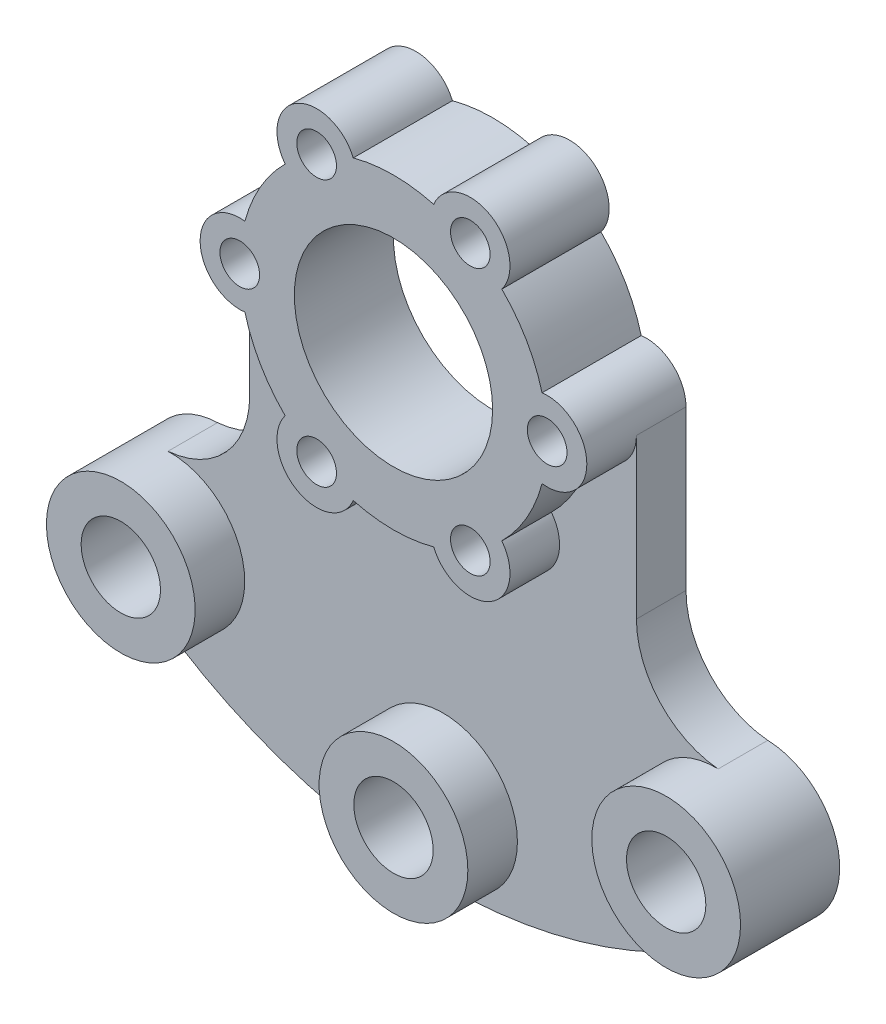
ISO-10303-21;
HEADER;
FILE_DESCRIPTION(('STEP AP214'),'2;1');
FILE_NAME('part.step','',(''),(''),'','','');
FILE_SCHEMA(('AUTOMOTIVE_DESIGN { 1 0 10303 214 1 1 1 1 }'));
ENDSEC;
DATA;
#1=APPLICATION_CONTEXT('core data for automotive mechanical design processes');
#2=APPLICATION_PROTOCOL_DEFINITION('international standard','automotive_design',2000,#1);
#3=PRODUCT_CONTEXT('',#1,'mechanical');
#4=PRODUCT('Part','Part','',(#3));
#5=PRODUCT_RELATED_PRODUCT_CATEGORY('part','',(#4));
#6=PRODUCT_DEFINITION_FORMATION('','',#4);
#7=PRODUCT_DEFINITION_CONTEXT('part definition',#1,'design');
#8=PRODUCT_DEFINITION('design','',#6,#7);
#9=PRODUCT_DEFINITION_SHAPE('','',#8);
#10=(LENGTH_UNIT() NAMED_UNIT(*) SI_UNIT(.MILLI.,.METRE.));
#11=(NAMED_UNIT(*) PLANE_ANGLE_UNIT() SI_UNIT($,.RADIAN.));
#12=(NAMED_UNIT(*) SI_UNIT($,.STERADIAN.) SOLID_ANGLE_UNIT());
#13=UNCERTAINTY_MEASURE_WITH_UNIT(LENGTH_MEASURE(1.E-05),#10,'distance_accuracy_value','');
#14=(GEOMETRIC_REPRESENTATION_CONTEXT(3) GLOBAL_UNCERTAINTY_ASSIGNED_CONTEXT((#13)) GLOBAL_UNIT_ASSIGNED_CONTEXT((#10,
#11,#12)) REPRESENTATION_CONTEXT('',''));
#15=CARTESIAN_POINT('',(0.,0.,0.));
#16=DIRECTION('',(0.,0.,1.));
#17=DIRECTION('',(1.,0.,0.));
#18=AXIS2_PLACEMENT_3D('',#15,#16,#17);
#19=CARTESIAN_POINT('',(-57.,-32.0714767894795,10.));
#20=DIRECTION('',(0.,0.,-1.));
#21=DIRECTION('',(-1.,0.,0.));
#22=AXIS2_PLACEMENT_3D('',#19,#20,#21);
#23=CYLINDRICAL_SURFACE('',#22,18.);
#24=DIRECTION('',(0.,0.,-1.));
#25=VECTOR('',#24,1.);
#26=CARTESIAN_POINT('',(-55.4895461730134,-50.0079906435299,10.));
#27=LINE('',#26,#25);
#28=CARTESIAN_POINT('',(-55.4895461730134,-50.0079906435299,10.));
#29=VERTEX_POINT('',#28);
#30=CARTESIAN_POINT('',(-55.4895461730134,-50.0079906435299,0.));
#31=VERTEX_POINT('',#30);
#32=EDGE_CURVE('E193',#29,#31,#27,.T.);
#33=ORIENTED_EDGE('',*,*,#32,.F.);
#34=CARTESIAN_POINT('',(-57.,-32.0714767894795,10.));
#35=DIRECTION('',(0.,0.,-1.));
#36=DIRECTION('',(1.,0.,0.));
#37=AXIS2_PLACEMENT_3D('',#34,#35,#36);
#38=CIRCLE('',#37,18.);
#39=CARTESIAN_POINT('',(-39.,-32.0714767894795,10.));
#40=VERTEX_POINT('',#39);
#41=EDGE_CURVE('E388',#40,#29,#38,.T.);
#42=ORIENTED_EDGE('',*,*,#41,.F.);
#43=DIRECTION('',(0.,0.,-1.));
#44=VECTOR('',#43,1.);
#45=CARTESIAN_POINT('',(-39.,-32.0714767894795,10.));
#46=LINE('',#45,#44);
#47=CARTESIAN_POINT('',(-39.,-32.0714767894795,0.));
#48=VERTEX_POINT('',#47);
#49=EDGE_CURVE('E204',#40,#48,#46,.T.);
#50=ORIENTED_EDGE('',*,*,#49,.T.);
#51=CARTESIAN_POINT('',(-57.,-32.0714767894795,0.));
#52=DIRECTION('',(0.,0.,-1.));
#53=DIRECTION('',(1.,0.,0.));
#54=AXIS2_PLACEMENT_3D('',#51,#52,#53);
#55=CIRCLE('',#54,18.);
#56=EDGE_CURVE('E186',#48,#31,#55,.T.);
#57=ORIENTED_EDGE('',*,*,#56,.T.);
#58=EDGE_LOOP('',(#33,#42,#50,#57));
#59=FACE_BOUND('',#58,.T.);
#60=ADVANCED_FACE('F43',(#59),#23,.F.);
#61=CARTESIAN_POINT('',(57.,-32.0714767894795,10.));
#62=DIRECTION('',(0.,0.,-1.));
#63=DIRECTION('',(-1.,0.,0.));
#64=AXIS2_PLACEMENT_3D('',#61,#62,#63);
#65=CYLINDRICAL_SURFACE('',#64,18.);
#66=DIRECTION('',(0.,0.,-1.));
#67=VECTOR('',#66,1.);
#68=CARTESIAN_POINT('',(55.4895461730133,-50.0079906435299,10.));
#69=LINE('',#68,#67);
#70=CARTESIAN_POINT('',(55.4895461730133,-50.0079906435299,0.));
#71=VERTEX_POINT('',#70);
#72=CARTESIAN_POINT('',(55.4895461730133,-50.0079906435299,10.));
#73=VERTEX_POINT('',#72);
#74=EDGE_CURVE('E362',#71,#73,#69,.F.);
#75=ORIENTED_EDGE('',*,*,#74,.F.);
#76=CARTESIAN_POINT('',(57.,-32.0714767894795,0.));
#77=DIRECTION('',(0.,0.,-1.));
#78=DIRECTION('',(-1.,0.,0.));
#79=AXIS2_PLACEMENT_3D('',#76,#77,#78);
#80=CIRCLE('',#79,18.);
#81=CARTESIAN_POINT('',(39.,-32.0714767894795,0.));
#82=VERTEX_POINT('',#81);
#83=EDGE_CURVE('E213',#71,#82,#80,.T.);
#84=ORIENTED_EDGE('',*,*,#83,.T.);
#85=DIRECTION('',(0.,0.,-1.));
#86=VECTOR('',#85,1.);
#87=CARTESIAN_POINT('',(39.,-32.0714767894795,10.));
#88=LINE('',#87,#86);
#89=CARTESIAN_POINT('',(39.,-32.0714767894795,10.));
#90=VERTEX_POINT('',#89);
#91=EDGE_CURVE('E222',#90,#82,#88,.T.);
#92=ORIENTED_EDGE('',*,*,#91,.F.);
#93=CARTESIAN_POINT('',(57.,-32.0714767894795,10.));
#94=DIRECTION('',(0.,0.,-1.));
#95=DIRECTION('',(-1.,0.,0.));
#96=AXIS2_PLACEMENT_3D('',#93,#94,#95);
#97=CIRCLE('',#96,18.);
#98=EDGE_CURVE('E392',#73,#90,#97,.T.);
#99=ORIENTED_EDGE('',*,*,#98,.F.);
#100=EDGE_LOOP('',(#75,#84,#92,#99));
#101=FACE_BOUND('',#100,.T.);
#102=ADVANCED_FACE('F488',(#101),#65,.F.);
#103=CARTESIAN_POINT('',(-31.,2.16471843008274E-13,20.));
#104=DIRECTION('',(0.,0.,-1.));
#105=DIRECTION('',(-1.,0.,0.));
#106=AXIS2_PLACEMENT_3D('',#103,#104,#105);
#107=CYLINDRICAL_SURFACE('',#106,7.99999999999999);
#108=DIRECTION('',(0.,0.,-1.));
#109=VECTOR('',#108,1.);
#110=CARTESIAN_POINT('',(-39.,0.,10.));
#111=LINE('',#110,#109);
#112=CARTESIAN_POINT('',(-39.,0.,10.));
#113=VERTEX_POINT('',#112);
#114=CARTESIAN_POINT('',(-39.,2.16471843008274E-13,0.));
#115=VERTEX_POINT('',#114);
#116=EDGE_CURVE('E231',#113,#115,#111,.T.);
#117=ORIENTED_EDGE('',*,*,#116,.F.);
#118=CARTESIAN_POINT('',(-30.9999999978276,2.47358876671053E-09,10.));
#119=DIRECTION('',(0.,0.,-1.));
#120=DIRECTION('',(1.,0.,0.));
#121=AXIS2_PLACEMENT_3D('',#118,#119,#120);
#122=CIRCLE('',#121,8.00000000217236);
#123=CARTESIAN_POINT('',(-29.9677419354839,-7.9331231736459,10.));
#124=VERTEX_POINT('',#123);
#125=EDGE_CURVE('E383',#124,#113,#122,.T.);
#126=ORIENTED_EDGE('',*,*,#125,.F.);
#127=DIRECTION('',(0.,0.,-1.));
#128=VECTOR('',#127,1.);
#129=CARTESIAN_POINT('',(-29.9677419354839,-7.9331231736459,20.));
#130=LINE('',#129,#128);
#131=CARTESIAN_POINT('',(-29.9677419354839,-7.9331231736459,20.));
#132=VERTEX_POINT('',#131);
#133=EDGE_CURVE('E340',#132,#124,#130,.T.);
#134=ORIENTED_EDGE('',*,*,#133,.F.);
#135=CARTESIAN_POINT('',(-31.,2.16471843008274E-13,20.));
#136=DIRECTION('',(0.,0.,1.));
#137=DIRECTION('',(1.,0.,0.));
#138=AXIS2_PLACEMENT_3D('',#135,#136,#137);
#139=CIRCLE('',#138,7.99999999999999);
#140=CARTESIAN_POINT('',(-29.9677419354838,7.93312317364634,20.));
#141=VERTEX_POINT('',#140);
#142=EDGE_CURVE('E285',#141,#132,#139,.T.);
#143=ORIENTED_EDGE('',*,*,#142,.F.);
#144=DIRECTION('',(0.,0.,-1.));
#145=VECTOR('',#144,1.);
#146=CARTESIAN_POINT('',(-29.9677419354838,7.93312317364634,20.));
#147=LINE('',#146,#145);
#148=CARTESIAN_POINT('',(-29.9677419354838,7.93312317364634,0.));
#149=VERTEX_POINT('',#148);
#150=EDGE_CURVE('E343',#141,#149,#147,.T.);
#151=ORIENTED_EDGE('',*,*,#150,.T.);
#152=CARTESIAN_POINT('',(-31.,2.16471843008274E-13,0.));
#153=DIRECTION('',(0.,0.,1.));
#154=DIRECTION('',(1.,0.,0.));
#155=AXIS2_PLACEMENT_3D('',#152,#153,#154);
#156=CIRCLE('',#155,7.99999999999999);
#157=EDGE_CURVE('E310',#149,#115,#156,.T.);
#158=ORIENTED_EDGE('',*,*,#157,.T.);
#159=EDGE_LOOP('',(#117,#126,#134,#143,#151,#158));
#160=FACE_BOUND('',#159,.T.);
#161=ADVANCED_FACE('F429',(#160),#107,.T.);
#162=CARTESIAN_POINT('',(-7.74999999999987,13.4233937586589,20.));
#163=DIRECTION('',(0.,0.,1.));
#164=DIRECTION('',(1.,0.,0.));
#165=AXIS2_PLACEMENT_3D('',#162,#163,#164);
#166=PLANE('',#165);
#167=CARTESIAN_POINT('',(-15.4999999999997,26.8467875173177,20.));
#168=DIRECTION('',(0.,0.,1.));
#169=DIRECTION('',(1.,0.,0.));
#170=AXIS2_PLACEMENT_3D('',#167,#168,#169);
#171=CIRCLE('',#170,4.);
#172=CARTESIAN_POINT('',(-11.4999999999997,26.8467875173177,20.));
#173=VERTEX_POINT('',#172);
#174=EDGE_CURVE('E241',#173,#173,#171,.T.);
#175=ORIENTED_EDGE('',*,*,#174,.F.);
#176=EDGE_LOOP('',(#175));
#177=FACE_BOUND('',#176,.T.);
#178=CARTESIAN_POINT('',(-15.5000000000001,-26.8467875173175,20.));
#179=DIRECTION('',(0.,0.,1.));
#180=DIRECTION('',(1.,0.,0.));
#181=AXIS2_PLACEMENT_3D('',#178,#179,#180);
#182=CIRCLE('',#181,4.00000000000001);
#183=CARTESIAN_POINT('',(-11.5000000000001,-26.8467875173175,20.));
#184=VERTEX_POINT('',#183);
#185=EDGE_CURVE('E253',#184,#184,#182,.T.);
#186=ORIENTED_EDGE('',*,*,#185,.F.);
#187=EDGE_LOOP('',(#186));
#188=FACE_BOUND('',#187,.T.);
#189=CARTESIAN_POINT('',(31.,0.,20.));
#190=DIRECTION('',(0.,0.,1.));
#191=DIRECTION('',(1.,0.,0.));
#192=AXIS2_PLACEMENT_3D('',#189,#190,#191);
#193=CIRCLE('',#192,4.00000000000001);
#194=CARTESIAN_POINT('',(35.,0.,20.));
#195=VERTEX_POINT('',#194);
#196=EDGE_CURVE('E265',#195,#195,#193,.T.);
#197=ORIENTED_EDGE('',*,*,#196,.F.);
#198=EDGE_LOOP('',(#197));
#199=FACE_BOUND('',#198,.T.);
#200=CARTESIAN_POINT('',(0.,0.,20.));
#201=DIRECTION('',(0.,0.,1.));
#202=DIRECTION('',(1.,0.,0.));
#203=AXIS2_PLACEMENT_3D('',#200,#201,#202);
#204=CIRCLE('',#203,31.);
#205=CARTESIAN_POINT('',(8.11358476801371,29.9193873970083,20.));
#206=VERTEX_POINT('',#205);
#207=CARTESIAN_POINT('',(-8.11358476801307,29.9193873970084,20.));
#208=VERTEX_POINT('',#207);
#209=EDGE_CURVE('E277',#206,#208,#204,.T.);
#210=ORIENTED_EDGE('',*,*,#209,.T.);
#211=CARTESIAN_POINT('',(-15.4999999999997,26.8467875173177,20.));
#212=DIRECTION('',(0.,0.,1.));
#213=DIRECTION('',(1.,0.,0.));
#214=AXIS2_PLACEMENT_3D('',#211,#212,#213);
#215=CIRCLE('',#214,8.);
#216=CARTESIAN_POINT('',(-21.8541571674703,21.9862642233624,20.));
#217=VERTEX_POINT('',#216);
#218=EDGE_CURVE('E280',#208,#217,#215,.T.);
#219=ORIENTED_EDGE('',*,*,#218,.T.);
#220=CARTESIAN_POINT('',(0.,0.,20.));
#221=DIRECTION('',(0.,0.,1.));
#222=DIRECTION('',(1.,0.,0.));
#223=AXIS2_PLACEMENT_3D('',#220,#221,#222);
#224=CIRCLE('',#223,31.);
#225=EDGE_CURVE('E283',#217,#141,#224,.T.);
#226=ORIENTED_EDGE('',*,*,#225,.T.);
#227=ORIENTED_EDGE('',*,*,#142,.T.);
#228=CARTESIAN_POINT('',(0.,0.,20.));
#229=DIRECTION('',(0.,0.,1.));
#230=DIRECTION('',(1.,0.,0.));
#231=AXIS2_PLACEMENT_3D('',#228,#229,#230);
#232=CIRCLE('',#231,31.);
#233=CARTESIAN_POINT('',(-21.8541571674706,-21.9862642233621,20.));
#234=VERTEX_POINT('',#233);
#235=EDGE_CURVE('E287',#132,#234,#232,.T.);
#236=ORIENTED_EDGE('',*,*,#235,.T.);
#237=CARTESIAN_POINT('',(-15.5000000000001,-26.8467875173175,20.));
#238=DIRECTION('',(0.,0.,1.));
#239=DIRECTION('',(1.,0.,0.));
#240=AXIS2_PLACEMENT_3D('',#237,#238,#239);
#241=CIRCLE('',#240,8.);
#242=CARTESIAN_POINT('',(-8.11358476801348,-29.9193873970083,20.));
#243=VERTEX_POINT('',#242);
#244=EDGE_CURVE('E289',#234,#243,#241,.T.);
#245=ORIENTED_EDGE('',*,*,#244,.T.);
#246=CARTESIAN_POINT('',(0.,0.,20.));
#247=DIRECTION('',(0.,0.,1.));
#248=DIRECTION('',(1.,0.,0.));
#249=AXIS2_PLACEMENT_3D('',#246,#247,#248);
#250=CIRCLE('',#249,31.);
#251=CARTESIAN_POINT('',(8.11358476801328,-29.9193873970084,20.));
#252=VERTEX_POINT('',#251);
#253=EDGE_CURVE('E291',#243,#252,#250,.T.);
#254=ORIENTED_EDGE('',*,*,#253,.T.);
#255=CARTESIAN_POINT('',(15.4999999999999,-26.8467875173176,20.));
#256=DIRECTION('',(0.,0.,1.));
#257=DIRECTION('',(1.,0.,0.));
#258=AXIS2_PLACEMENT_3D('',#255,#256,#257);
#259=CIRCLE('',#258,8.);
#260=CARTESIAN_POINT('',(21.8541571674705,-21.9862642233623,20.));
#261=VERTEX_POINT('',#260);
#262=EDGE_CURVE('E293',#252,#261,#259,.T.);
#263=ORIENTED_EDGE('',*,*,#262,.T.);
#264=CARTESIAN_POINT('',(0.,0.,20.));
#265=DIRECTION('',(0.,0.,1.));
#266=DIRECTION('',(1.,0.,0.));
#267=AXIS2_PLACEMENT_3D('',#264,#265,#266);
#268=CIRCLE('',#267,31.);
#269=CARTESIAN_POINT('',(29.9677419354839,-7.93312317364614,20.));
#270=VERTEX_POINT('',#269);
#271=EDGE_CURVE('E295',#261,#270,#268,.T.);
#272=ORIENTED_EDGE('',*,*,#271,.T.);
#273=CARTESIAN_POINT('',(31.,0.,20.));
#274=DIRECTION('',(0.,0.,1.));
#275=DIRECTION('',(1.,0.,0.));
#276=AXIS2_PLACEMENT_3D('',#273,#274,#275);
#277=CIRCLE('',#276,8.);
#278=CARTESIAN_POINT('',(29.9677419354839,7.93312317364614,20.));
#279=VERTEX_POINT('',#278);
#280=EDGE_CURVE('E297',#270,#279,#277,.T.);
#281=ORIENTED_EDGE('',*,*,#280,.T.);
#282=CARTESIAN_POINT('',(0.,0.,20.));
#283=DIRECTION('',(0.,0.,1.));
#284=DIRECTION('',(1.,0.,0.));
#285=AXIS2_PLACEMENT_3D('',#282,#283,#284);
#286=CIRCLE('',#285,31.);
#287=CARTESIAN_POINT('',(21.8541571674708,21.986264223362,20.));
#288=VERTEX_POINT('',#287);
#289=EDGE_CURVE('E299',#279,#288,#286,.T.);
#290=ORIENTED_EDGE('',*,*,#289,.T.);
#291=CARTESIAN_POINT('',(15.5000000000003,26.8467875173174,20.));
#292=DIRECTION('',(0.,0.,1.));
#293=DIRECTION('',(1.,0.,0.));
#294=AXIS2_PLACEMENT_3D('',#291,#292,#293);
#295=CIRCLE('',#294,7.99999999999999);
#296=EDGE_CURVE('E301',#288,#206,#295,.T.);
#297=ORIENTED_EDGE('',*,*,#296,.T.);
#298=EDGE_LOOP('',(#210,#219,#226,#227,#236,#245,#254,#263,#272,#281,#290,#297));
#299=FACE_BOUND('',#298,.T.);
#300=CARTESIAN_POINT('',(0.,0.,20.));
#301=DIRECTION('',(0.,0.,1.));
#302=DIRECTION('',(1.,0.,0.));
#303=AXIS2_PLACEMENT_3D('',#300,#301,#302);
#304=CIRCLE('',#303,20.);
#305=CARTESIAN_POINT('',(20.,0.,20.));
#306=VERTEX_POINT('',#305);
#307=EDGE_CURVE('E271',#306,#306,#304,.T.);
#308=ORIENTED_EDGE('',*,*,#307,.F.);
#309=EDGE_LOOP('',(#308));
#310=FACE_BOUND('',#309,.T.);
#311=CARTESIAN_POINT('',(15.4999999999999,-26.8467875173176,20.));
#312=DIRECTION('',(0.,0.,1.));
#313=DIRECTION('',(1.,0.,0.));
#314=AXIS2_PLACEMENT_3D('',#311,#312,#313);
#315=CIRCLE('',#314,4.00000000000001);
#316=CARTESIAN_POINT('',(19.4999999999999,-26.8467875173176,20.));
#317=VERTEX_POINT('',#316);
#318=EDGE_CURVE('E259',#317,#317,#315,.T.);
#319=ORIENTED_EDGE('',*,*,#318,.F.);
#320=EDGE_LOOP('',(#319));
#321=FACE_BOUND('',#320,.T.);
#322=CARTESIAN_POINT('',(-31.,2.16471843008274E-13,20.));
#323=DIRECTION('',(0.,0.,1.));
#324=DIRECTION('',(1.,0.,0.));
#325=AXIS2_PLACEMENT_3D('',#322,#323,#324);
#326=CIRCLE('',#325,4.00000000000001);
#327=CARTESIAN_POINT('',(-27.,2.16471843008274E-13,20.));
#328=VERTEX_POINT('',#327);
#329=EDGE_CURVE('E247',#328,#328,#326,.T.);
#330=ORIENTED_EDGE('',*,*,#329,.F.);
#331=EDGE_LOOP('',(#330));
#332=FACE_BOUND('',#331,.T.);
#333=CARTESIAN_POINT('',(15.5000000000003,26.8467875173174,20.));
#334=DIRECTION('',(0.,0.,1.));
#335=DIRECTION('',(1.,0.,0.));
#336=AXIS2_PLACEMENT_3D('',#333,#334,#335);
#337=CIRCLE('',#336,4.);
#338=CARTESIAN_POINT('',(19.5000000000003,26.8467875173174,20.));
#339=VERTEX_POINT('',#338);
#340=EDGE_CURVE('E235',#339,#339,#337,.T.);
#341=ORIENTED_EDGE('',*,*,#340,.F.);
#342=EDGE_LOOP('',(#341));
#343=FACE_BOUND('',#342,.T.);
#344=ADVANCED_FACE('F456',(#177,#188,#199,#299,#310,#321,#332,#343),#166,.T.);
#345=CARTESIAN_POINT('',(-7.74999999999987,13.4233937586589,0.));
#346=DIRECTION('',(0.,0.,1.));
#347=DIRECTION('',(1.,0.,0.));
#348=AXIS2_PLACEMENT_3D('',#345,#346,#347);
#349=PLANE('',#348);
#350=CARTESIAN_POINT('',(-55.,-65.,0.));
#351=DIRECTION('',(0.,0.,1.));
#352=DIRECTION('',(1.,0.,0.));
#353=AXIS2_PLACEMENT_3D('',#350,#351,#352);
#354=CIRCLE('',#353,8.00000000000001);
#355=CARTESIAN_POINT('',(-47.,-65.,0.));
#356=VERTEX_POINT('',#355);
#357=EDGE_CURVE('E844',#356,#356,#354,.T.);
#358=ORIENTED_EDGE('',*,*,#357,.T.);
#359=EDGE_LOOP('',(#358));
#360=FACE_BOUND('',#359,.T.);
#361=CARTESIAN_POINT('',(0.,-82.97,0.));
#362=DIRECTION('',(0.,0.,1.));
#363=DIRECTION('',(1.,0.,0.));
#364=AXIS2_PLACEMENT_3D('',#361,#362,#363);
#365=CIRCLE('',#364,8.00000000000002);
#366=CARTESIAN_POINT('',(8.00000000000004,-82.97,0.));
#367=VERTEX_POINT('',#366);
#368=EDGE_CURVE('E848',#367,#367,#365,.T.);
#369=ORIENTED_EDGE('',*,*,#368,.T.);
#370=EDGE_LOOP('',(#369));
#371=FACE_BOUND('',#370,.T.);
#372=CARTESIAN_POINT('',(55.,-65.,0.));
#373=DIRECTION('',(0.,0.,1.));
#374=DIRECTION('',(1.,0.,0.));
#375=AXIS2_PLACEMENT_3D('',#372,#373,#374);
#376=CIRCLE('',#375,8.00000000000002);
#377=CARTESIAN_POINT('',(63.,-65.,0.));
#378=VERTEX_POINT('',#377);
#379=EDGE_CURVE('E845',#378,#378,#376,.T.);
#380=ORIENTED_EDGE('',*,*,#379,.T.);
#381=EDGE_LOOP('',(#380));
#382=FACE_BOUND('',#381,.T.);
#383=CARTESIAN_POINT('',(0.,2.02858892996811,0.));
#384=DIRECTION('',(0.,0.,1.));
#385=DIRECTION('',(-1.,0.,0.));
#386=AXIS2_PLACEMENT_3D('',#383,#384,#385);
#387=CIRCLE('',#386,100.);
#388=CARTESIAN_POINT('',(-57.4935431919826,-79.7912894079494,0.));
#389=VERTEX_POINT('',#388);
#390=CARTESIAN_POINT('',(57.4935431919826,-79.7912894079494,0.));
#391=VERTEX_POINT('',#390);
#392=EDGE_CURVE('E187',#389,#391,#387,.T.);
#393=ORIENTED_EDGE('',*,*,#392,.F.);
#394=CARTESIAN_POINT('',(-55.,-65.,0.));
#395=DIRECTION('',(0.,0.,1.));
#396=DIRECTION('',(1.,0.,0.));
#397=AXIS2_PLACEMENT_3D('',#394,#395,#396);
#398=CIRCLE('',#397,15.);
#399=EDGE_CURVE('E180',#31,#389,#398,.T.);
#400=ORIENTED_EDGE('',*,*,#399,.F.);
#401=ORIENTED_EDGE('',*,*,#56,.F.);
#402=DIRECTION('',(0.,-1.,0.));
#403=VECTOR('',#402,1.);
#404=CARTESIAN_POINT('',(-39.,0.,0.));
#405=LINE('',#404,#403);
#406=EDGE_CURVE('E205',#115,#48,#405,.T.);
#407=ORIENTED_EDGE('',*,*,#406,.F.);
#408=ORIENTED_EDGE('',*,*,#157,.F.);
#409=CARTESIAN_POINT('',(0.,0.,0.));
#410=DIRECTION('',(0.,0.,1.));
#411=DIRECTION('',(1.,0.,0.));
#412=AXIS2_PLACEMENT_3D('',#409,#410,#411);
#413=CIRCLE('',#412,31.);
#414=CARTESIAN_POINT('',(-21.8541571674703,21.9862642233624,0.));
#415=VERTEX_POINT('',#414);
#416=EDGE_CURVE('E308',#415,#149,#413,.T.);
#417=ORIENTED_EDGE('',*,*,#416,.F.);
#418=CARTESIAN_POINT('',(-15.4999999999997,26.8467875173177,0.));
#419=DIRECTION('',(0.,0.,1.));
#420=DIRECTION('',(1.,0.,0.));
#421=AXIS2_PLACEMENT_3D('',#418,#419,#420);
#422=CIRCLE('',#421,8.);
#423=CARTESIAN_POINT('',(-8.11358476801307,29.9193873970084,0.));
#424=VERTEX_POINT('',#423);
#425=EDGE_CURVE('E306',#424,#415,#422,.T.);
#426=ORIENTED_EDGE('',*,*,#425,.F.);
#427=CARTESIAN_POINT('',(0.,0.,0.));
#428=DIRECTION('',(0.,0.,1.));
#429=DIRECTION('',(1.,0.,0.));
#430=AXIS2_PLACEMENT_3D('',#427,#428,#429);
#431=CIRCLE('',#430,31.);
#432=CARTESIAN_POINT('',(8.11358476801371,29.9193873970083,0.));
#433=VERTEX_POINT('',#432);
#434=EDGE_CURVE('E274',#433,#424,#431,.T.);
#435=ORIENTED_EDGE('',*,*,#434,.F.);
#436=CARTESIAN_POINT('',(15.5000000000003,26.8467875173174,0.));
#437=DIRECTION('',(0.,0.,1.));
#438=DIRECTION('',(1.,0.,0.));
#439=AXIS2_PLACEMENT_3D('',#436,#437,#438);
#440=CIRCLE('',#439,7.99999999999999);
#441=CARTESIAN_POINT('',(21.8541571674708,21.986264223362,0.));
#442=VERTEX_POINT('',#441);
#443=EDGE_CURVE('E281',#442,#433,#440,.T.);
#444=ORIENTED_EDGE('',*,*,#443,.F.);
#445=CARTESIAN_POINT('',(0.,0.,0.));
#446=DIRECTION('',(0.,0.,1.));
#447=DIRECTION('',(1.,0.,0.));
#448=AXIS2_PLACEMENT_3D('',#445,#446,#447);
#449=CIRCLE('',#448,31.);
#450=CARTESIAN_POINT('',(29.9677419354839,7.93312317364614,0.));
#451=VERTEX_POINT('',#450);
#452=EDGE_CURVE('E314',#451,#442,#449,.T.);
#453=ORIENTED_EDGE('',*,*,#452,.F.);
#454=CARTESIAN_POINT('',(31.,0.,0.));
#455=DIRECTION('',(0.,0.,1.));
#456=DIRECTION('',(1.,0.,0.));
#457=AXIS2_PLACEMENT_3D('',#454,#455,#456);
#458=CIRCLE('',#457,8.);
#459=CARTESIAN_POINT('',(39.,0.,0.));
#460=VERTEX_POINT('',#459);
#461=EDGE_CURVE('E312',#460,#451,#458,.T.);
#462=ORIENTED_EDGE('',*,*,#461,.F.);
#463=DIRECTION('',(0.,1.,0.));
#464=VECTOR('',#463,1.);
#465=CARTESIAN_POINT('',(39.,0.,0.));
#466=LINE('',#465,#464);
#467=EDGE_CURVE('E215',#82,#460,#466,.T.);
#468=ORIENTED_EDGE('',*,*,#467,.F.);
#469=ORIENTED_EDGE('',*,*,#83,.F.);
#470=CARTESIAN_POINT('',(55.,-65.,0.));
#471=DIRECTION('',(0.,0.,1.));
#472=DIRECTION('',(-1.,0.,0.));
#473=AXIS2_PLACEMENT_3D('',#470,#471,#472);
#474=CIRCLE('',#473,15.);
#475=EDGE_CURVE('E58',#391,#71,#474,.T.);
#476=ORIENTED_EDGE('',*,*,#475,.F.);
#477=EDGE_LOOP('',(#393,#400,#401,#407,#408,#417,#426,#435,#444,#453,#462,#468,#469,#476));
#478=FACE_BOUND('',#477,.T.);
#479=CARTESIAN_POINT('',(0.,0.,0.));
#480=DIRECTION('',(0.,0.,1.));
#481=DIRECTION('',(1.,0.,0.));
#482=AXIS2_PLACEMENT_3D('',#479,#480,#481);
#483=CIRCLE('',#482,20.);
#484=CARTESIAN_POINT('',(20.,0.,0.));
#485=VERTEX_POINT('',#484);
#486=EDGE_CURVE('E268',#485,#485,#483,.T.);
#487=ORIENTED_EDGE('',*,*,#486,.T.);
#488=EDGE_LOOP('',(#487));
#489=FACE_BOUND('',#488,.T.);
#490=CARTESIAN_POINT('',(31.,0.,0.));
#491=DIRECTION('',(0.,0.,1.));
#492=DIRECTION('',(1.,0.,0.));
#493=AXIS2_PLACEMENT_3D('',#490,#491,#492);
#494=CIRCLE('',#493,4.00000000000001);
#495=CARTESIAN_POINT('',(35.,0.,0.));
#496=VERTEX_POINT('',#495);
#497=EDGE_CURVE('E262',#496,#496,#494,.T.);
#498=ORIENTED_EDGE('',*,*,#497,.T.);
#499=EDGE_LOOP('',(#498));
#500=FACE_BOUND('',#499,.T.);
#501=CARTESIAN_POINT('',(15.4999999999999,-26.8467875173176,0.));
#502=DIRECTION('',(0.,0.,1.));
#503=DIRECTION('',(1.,0.,0.));
#504=AXIS2_PLACEMENT_3D('',#501,#502,#503);
#505=CIRCLE('',#504,4.00000000000001);
#506=CARTESIAN_POINT('',(19.4999999999999,-26.8467875173176,0.));
#507=VERTEX_POINT('',#506);
#508=EDGE_CURVE('E256',#507,#507,#505,.T.);
#509=ORIENTED_EDGE('',*,*,#508,.T.);
#510=EDGE_LOOP('',(#509));
#511=FACE_BOUND('',#510,.T.);
#512=CARTESIAN_POINT('',(-15.5000000000001,-26.8467875173175,0.));
#513=DIRECTION('',(0.,0.,1.));
#514=DIRECTION('',(1.,0.,0.));
#515=AXIS2_PLACEMENT_3D('',#512,#513,#514);
#516=CIRCLE('',#515,4.00000000000001);
#517=CARTESIAN_POINT('',(-11.5000000000001,-26.8467875173175,0.));
#518=VERTEX_POINT('',#517);
#519=EDGE_CURVE('E250',#518,#518,#516,.T.);
#520=ORIENTED_EDGE('',*,*,#519,.T.);
#521=EDGE_LOOP('',(#520));
#522=FACE_BOUND('',#521,.T.);
#523=CARTESIAN_POINT('',(-31.,2.16471843008274E-13,0.));
#524=DIRECTION('',(0.,0.,1.));
#525=DIRECTION('',(1.,0.,0.));
#526=AXIS2_PLACEMENT_3D('',#523,#524,#525);
#527=CIRCLE('',#526,4.00000000000001);
#528=CARTESIAN_POINT('',(-27.,2.16471843008274E-13,0.));
#529=VERTEX_POINT('',#528);
#530=EDGE_CURVE('E244',#529,#529,#527,.T.);
#531=ORIENTED_EDGE('',*,*,#530,.T.);
#532=EDGE_LOOP('',(#531));
#533=FACE_BOUND('',#532,.T.);
#534=CARTESIAN_POINT('',(-15.4999999999997,26.8467875173177,0.));
#535=DIRECTION('',(0.,0.,1.));
#536=DIRECTION('',(1.,0.,0.));
#537=AXIS2_PLACEMENT_3D('',#534,#535,#536);
#538=CIRCLE('',#537,4.);
#539=CARTESIAN_POINT('',(-11.4999999999997,26.8467875173177,0.));
#540=VERTEX_POINT('',#539);
#541=EDGE_CURVE('E238',#540,#540,#538,.T.);
#542=ORIENTED_EDGE('',*,*,#541,.T.);
#543=EDGE_LOOP('',(#542));
#544=FACE_BOUND('',#543,.T.);
#545=CARTESIAN_POINT('',(15.5000000000003,26.8467875173174,0.));
#546=DIRECTION('',(0.,0.,1.));
#547=DIRECTION('',(1.,0.,0.));
#548=AXIS2_PLACEMENT_3D('',#545,#546,#547);
#549=CIRCLE('',#548,4.);
#550=CARTESIAN_POINT('',(19.5000000000003,26.8467875173174,0.));
#551=VERTEX_POINT('',#550);
#552=EDGE_CURVE('E234',#551,#551,#549,.T.);
#553=ORIENTED_EDGE('',*,*,#552,.T.);
#554=EDGE_LOOP('',(#553));
#555=FACE_BOUND('',#554,.T.);
#556=ADVANCED_FACE('F182',(#360,#371,#382,#478,#489,#500,#511,#522,#533,#544,#555),#349,.F.);
#557=CARTESIAN_POINT('',(0.,0.,20.));
#558=DIRECTION('',(0.,0.,-1.));
#559=DIRECTION('',(-1.,0.,0.));
#560=AXIS2_PLACEMENT_3D('',#557,#558,#559);
#561=CYLINDRICAL_SURFACE('',#560,31.);
#562=ORIENTED_EDGE('',*,*,#434,.T.);
#563=DIRECTION('',(0.,0.,-1.));
#564=VECTOR('',#563,1.);
#565=CARTESIAN_POINT('',(-8.11358476801307,29.9193873970084,20.));
#566=LINE('',#565,#564);
#567=EDGE_CURVE('E349',#208,#424,#566,.T.);
#568=ORIENTED_EDGE('',*,*,#567,.F.);
#569=ORIENTED_EDGE('',*,*,#209,.F.);
#570=DIRECTION('',(0.,0.,-1.));
#571=VECTOR('',#570,1.);
#572=CARTESIAN_POINT('',(8.11358476801371,29.9193873970083,20.));
#573=LINE('',#572,#571);
#574=EDGE_CURVE('E303',#206,#433,#573,.T.);
#575=ORIENTED_EDGE('',*,*,#574,.T.);
#576=EDGE_LOOP('',(#562,#568,#569,#575));
#577=FACE_BOUND('',#576,.T.);
#578=ADVANCED_FACE('F45',(#577),#561,.T.);
#579=CARTESIAN_POINT('',(-15.4999999999997,26.8467875173177,20.));
#580=DIRECTION('',(0.,0.,-1.));
#581=DIRECTION('',(-1.,0.,0.));
#582=AXIS2_PLACEMENT_3D('',#579,#580,#581);
#583=CYLINDRICAL_SURFACE('',#582,8.);
#584=ORIENTED_EDGE('',*,*,#425,.T.);
#585=DIRECTION('',(0.,0.,-1.));
#586=VECTOR('',#585,1.);
#587=CARTESIAN_POINT('',(-21.8541571674703,21.9862642233624,20.));
#588=LINE('',#587,#586);
#589=EDGE_CURVE('E346',#217,#415,#588,.T.);
#590=ORIENTED_EDGE('',*,*,#589,.F.);
#591=ORIENTED_EDGE('',*,*,#218,.F.);
#592=ORIENTED_EDGE('',*,*,#567,.T.);
#593=EDGE_LOOP('',(#584,#590,#591,#592));
#594=FACE_BOUND('',#593,.T.);
#595=ADVANCED_FACE('F441',(#594),#583,.T.);
#596=CARTESIAN_POINT('',(0.,0.,20.));
#597=DIRECTION('',(0.,0.,-1.));
#598=DIRECTION('',(-1.,0.,0.));
#599=AXIS2_PLACEMENT_3D('',#596,#597,#598);
#600=CYLINDRICAL_SURFACE('',#599,31.);
#601=ORIENTED_EDGE('',*,*,#416,.T.);
#602=ORIENTED_EDGE('',*,*,#150,.F.);
#603=ORIENTED_EDGE('',*,*,#225,.F.);
#604=ORIENTED_EDGE('',*,*,#589,.T.);
#605=EDGE_LOOP('',(#601,#602,#603,#604));
#606=FACE_BOUND('',#605,.T.);
#607=ADVANCED_FACE('F437',(#606),#600,.T.);
#608=CARTESIAN_POINT('',(0.,0.,20.));
#609=DIRECTION('',(0.,0.,-1.));
#610=DIRECTION('',(-1.,0.,0.));
#611=AXIS2_PLACEMENT_3D('',#608,#609,#610);
#612=CYLINDRICAL_SURFACE('',#611,31.);
#613=ORIENTED_EDGE('',*,*,#133,.T.);
#614=CARTESIAN_POINT('',(0.,0.,10.));
#615=DIRECTION('',(0.,0.,-1.));
#616=DIRECTION('',(1.,0.,0.));
#617=AXIS2_PLACEMENT_3D('',#614,#615,#616);
#618=CIRCLE('',#617,31.);
#619=CARTESIAN_POINT('',(-21.8541571674706,-21.9862642233621,10.));
#620=VERTEX_POINT('',#619);
#621=EDGE_CURVE('E380',#620,#124,#618,.T.);
#622=ORIENTED_EDGE('',*,*,#621,.F.);
#623=DIRECTION('',(0.,0.,-1.));
#624=VECTOR('',#623,1.);
#625=CARTESIAN_POINT('',(-21.8541571674706,-21.9862642233621,20.));
#626=LINE('',#625,#624);
#627=EDGE_CURVE('E337',#234,#620,#626,.T.);
#628=ORIENTED_EDGE('',*,*,#627,.F.);
#629=ORIENTED_EDGE('',*,*,#235,.F.);
#630=EDGE_LOOP('',(#613,#622,#628,#629));
#631=FACE_BOUND('',#630,.T.);
#632=ADVANCED_FACE('F424',(#631),#612,.T.);
#633=CARTESIAN_POINT('',(-15.5000000000001,-26.8467875173175,20.));
#634=DIRECTION('',(0.,0.,-1.));
#635=DIRECTION('',(-1.,0.,0.));
#636=AXIS2_PLACEMENT_3D('',#633,#634,#635);
#637=CYLINDRICAL_SURFACE('',#636,8.);
#638=ORIENTED_EDGE('',*,*,#627,.T.);
#639=CARTESIAN_POINT('',(-15.5000000000001,-26.8467875173175,10.));
#640=DIRECTION('',(0.,0.,-1.));
#641=DIRECTION('',(-1.,0.,0.));
#642=AXIS2_PLACEMENT_3D('',#639,#640,#641);
#643=CIRCLE('',#642,8.00000000000001);
#644=CARTESIAN_POINT('',(-8.11358476801348,-29.9193873970083,10.));
#645=VERTEX_POINT('',#644);
#646=EDGE_CURVE('E377',#645,#620,#643,.T.);
#647=ORIENTED_EDGE('',*,*,#646,.F.);
#648=DIRECTION('',(0.,0.,-1.));
#649=VECTOR('',#648,1.);
#650=CARTESIAN_POINT('',(-8.11358476801348,-29.9193873970083,20.));
#651=LINE('',#650,#649);
#652=EDGE_CURVE('E334',#243,#645,#651,.T.);
#653=ORIENTED_EDGE('',*,*,#652,.F.);
#654=ORIENTED_EDGE('',*,*,#244,.F.);
#655=EDGE_LOOP('',(#638,#647,#653,#654));
#656=FACE_BOUND('',#655,.T.);
#657=ADVANCED_FACE('F420',(#656),#637,.T.);
#658=CARTESIAN_POINT('',(0.,0.,20.));
#659=DIRECTION('',(0.,0.,-1.));
#660=DIRECTION('',(-1.,0.,0.));
#661=AXIS2_PLACEMENT_3D('',#658,#659,#660);
#662=CYLINDRICAL_SURFACE('',#661,31.);
#663=ORIENTED_EDGE('',*,*,#652,.T.);
#664=CARTESIAN_POINT('',(0.,0.,10.));
#665=DIRECTION('',(0.,0.,-1.));
#666=DIRECTION('',(1.,0.,0.));
#667=AXIS2_PLACEMENT_3D('',#664,#665,#666);
#668=CIRCLE('',#667,31.);
#669=CARTESIAN_POINT('',(8.11358476801328,-29.9193873970084,10.));
#670=VERTEX_POINT('',#669);
#671=EDGE_CURVE('E374',#670,#645,#668,.T.);
#672=ORIENTED_EDGE('',*,*,#671,.F.);
#673=DIRECTION('',(0.,0.,-1.));
#674=VECTOR('',#673,1.);
#675=CARTESIAN_POINT('',(8.11358476801328,-29.9193873970084,20.));
#676=LINE('',#675,#674);
#677=EDGE_CURVE('E331',#252,#670,#676,.T.);
#678=ORIENTED_EDGE('',*,*,#677,.F.);
#679=ORIENTED_EDGE('',*,*,#253,.F.);
#680=EDGE_LOOP('',(#663,#672,#678,#679));
#681=FACE_BOUND('',#680,.T.);
#682=ADVANCED_FACE('F416',(#681),#662,.T.);
#683=CARTESIAN_POINT('',(15.4999999999999,-26.8467875173176,20.));
#684=DIRECTION('',(0.,0.,-1.));
#685=DIRECTION('',(-1.,0.,0.));
#686=AXIS2_PLACEMENT_3D('',#683,#684,#685);
#687=CYLINDRICAL_SURFACE('',#686,8.);
#688=ORIENTED_EDGE('',*,*,#677,.T.);
#689=CARTESIAN_POINT('',(15.4999999999999,-26.8467875173176,10.));
#690=DIRECTION('',(0.,0.,-1.));
#691=DIRECTION('',(1.,0.,0.));
#692=AXIS2_PLACEMENT_3D('',#689,#690,#691);
#693=CIRCLE('',#692,7.99999999999999);
#694=CARTESIAN_POINT('',(21.8541571674705,-21.9862642233623,10.));
#695=VERTEX_POINT('',#694);
#696=EDGE_CURVE('E371',#695,#670,#693,.T.);
#697=ORIENTED_EDGE('',*,*,#696,.F.);
#698=DIRECTION('',(0.,0.,-1.));
#699=VECTOR('',#698,1.);
#700=CARTESIAN_POINT('',(21.8541571674705,-21.9862642233623,20.));
#701=LINE('',#700,#699);
#702=EDGE_CURVE('E328',#261,#695,#701,.T.);
#703=ORIENTED_EDGE('',*,*,#702,.F.);
#704=ORIENTED_EDGE('',*,*,#262,.F.);
#705=EDGE_LOOP('',(#688,#697,#703,#704));
#706=FACE_BOUND('',#705,.T.);
#707=ADVANCED_FACE('F411',(#706),#687,.T.);
#708=CARTESIAN_POINT('',(0.,0.,20.));
#709=DIRECTION('',(0.,0.,-1.));
#710=DIRECTION('',(-1.,0.,0.));
#711=AXIS2_PLACEMENT_3D('',#708,#709,#710);
#712=CYLINDRICAL_SURFACE('',#711,31.);
#713=ORIENTED_EDGE('',*,*,#702,.T.);
#714=CARTESIAN_POINT('',(0.,0.,10.));
#715=DIRECTION('',(0.,0.,-1.));
#716=DIRECTION('',(1.,0.,0.));
#717=AXIS2_PLACEMENT_3D('',#714,#715,#716);
#718=CIRCLE('',#717,31.);
#719=CARTESIAN_POINT('',(29.9677419354839,-7.93312317364614,10.));
#720=VERTEX_POINT('',#719);
#721=EDGE_CURVE('E368',#720,#695,#718,.T.);
#722=ORIENTED_EDGE('',*,*,#721,.F.);
#723=DIRECTION('',(0.,0.,-1.));
#724=VECTOR('',#723,1.);
#725=CARTESIAN_POINT('',(29.9677419354839,-7.93312317364614,20.));
#726=LINE('',#725,#724);
#727=EDGE_CURVE('E325',#270,#720,#726,.T.);
#728=ORIENTED_EDGE('',*,*,#727,.F.);
#729=ORIENTED_EDGE('',*,*,#271,.F.);
#730=EDGE_LOOP('',(#713,#722,#728,#729));
#731=FACE_BOUND('',#730,.T.);
#732=ADVANCED_FACE('F408',(#731),#712,.T.);
#733=CARTESIAN_POINT('',(31.,0.,20.));
#734=DIRECTION('',(0.,0.,-1.));
#735=DIRECTION('',(-1.,0.,0.));
#736=AXIS2_PLACEMENT_3D('',#733,#734,#735);
#737=CYLINDRICAL_SURFACE('',#736,8.);
#738=CARTESIAN_POINT('',(30.9999999994549,6.20633934089009E-10,10.));
#739=DIRECTION('',(0.,0.,-1.));
#740=DIRECTION('',(1.,0.,0.));
#741=AXIS2_PLACEMENT_3D('',#738,#739,#740);
#742=CIRCLE('',#741,8.00000000054511);
#743=CARTESIAN_POINT('',(39.,0.,10.));
#744=VERTEX_POINT('',#743);
#745=EDGE_CURVE('E218',#744,#720,#742,.T.);
#746=ORIENTED_EDGE('',*,*,#745,.F.);
#747=DIRECTION('',(0.,0.,-1.));
#748=VECTOR('',#747,1.);
#749=CARTESIAN_POINT('',(39.,0.,10.));
#750=LINE('',#749,#748);
#751=EDGE_CURVE('E219',#744,#460,#750,.T.);
#752=ORIENTED_EDGE('',*,*,#751,.T.);
#753=ORIENTED_EDGE('',*,*,#461,.T.);
#754=DIRECTION('',(0.,0.,-1.));
#755=VECTOR('',#754,1.);
#756=CARTESIAN_POINT('',(29.9677419354839,7.93312317364614,20.));
#757=LINE('',#756,#755);
#758=EDGE_CURVE('E322',#279,#451,#757,.T.);
#759=ORIENTED_EDGE('',*,*,#758,.F.);
#760=ORIENTED_EDGE('',*,*,#280,.F.);
#761=ORIENTED_EDGE('',*,*,#727,.T.);
#762=EDGE_LOOP('',(#746,#752,#753,#759,#760,#761));
#763=FACE_BOUND('',#762,.T.);
#764=ADVANCED_FACE('F402',(#763),#737,.T.);
#765=CARTESIAN_POINT('',(0.,0.,20.));
#766=DIRECTION('',(0.,0.,-1.));
#767=DIRECTION('',(-1.,0.,0.));
#768=AXIS2_PLACEMENT_3D('',#765,#766,#767);
#769=CYLINDRICAL_SURFACE('',#768,31.);
#770=ORIENTED_EDGE('',*,*,#452,.T.);
#771=DIRECTION('',(0.,0.,-1.));
#772=VECTOR('',#771,1.);
#773=CARTESIAN_POINT('',(21.8541571674708,21.986264223362,20.));
#774=LINE('',#773,#772);
#775=EDGE_CURVE('E319',#288,#442,#774,.T.);
#776=ORIENTED_EDGE('',*,*,#775,.F.);
#777=ORIENTED_EDGE('',*,*,#289,.F.);
#778=ORIENTED_EDGE('',*,*,#758,.T.);
#779=EDGE_LOOP('',(#770,#776,#777,#778));
#780=FACE_BOUND('',#779,.T.);
#781=ADVANCED_FACE('F454',(#780),#769,.T.);
#782=CARTESIAN_POINT('',(15.5000000000003,26.8467875173174,20.));
#783=DIRECTION('',(0.,0.,-1.));
#784=DIRECTION('',(-1.,0.,0.));
#785=AXIS2_PLACEMENT_3D('',#782,#783,#784);
#786=CYLINDRICAL_SURFACE('',#785,7.99999999999999);
#787=ORIENTED_EDGE('',*,*,#443,.T.);
#788=ORIENTED_EDGE('',*,*,#574,.F.);
#789=ORIENTED_EDGE('',*,*,#296,.F.);
#790=ORIENTED_EDGE('',*,*,#775,.T.);
#791=EDGE_LOOP('',(#787,#788,#789,#790));
#792=FACE_BOUND('',#791,.T.);
#793=ADVANCED_FACE('F449',(#792),#786,.T.);
#794=CARTESIAN_POINT('',(0.,0.,20.));
#795=DIRECTION('',(0.,0.,-1.));
#796=DIRECTION('',(-1.,0.,0.));
#797=AXIS2_PLACEMENT_3D('',#794,#795,#796);
#798=CYLINDRICAL_SURFACE('',#797,20.);
#799=ORIENTED_EDGE('',*,*,#307,.T.);
#800=EDGE_LOOP('',(#799));
#801=FACE_BOUND('',#800,.T.);
#802=ORIENTED_EDGE('',*,*,#486,.F.);
#803=EDGE_LOOP('',(#802));
#804=FACE_BOUND('',#803,.T.);
#805=ADVANCED_FACE('F518',(#801,#804),#798,.F.);
#806=CARTESIAN_POINT('',(31.,0.,20.));
#807=DIRECTION('',(0.,0.,-1.));
#808=DIRECTION('',(-1.,0.,0.));
#809=AXIS2_PLACEMENT_3D('',#806,#807,#808);
#810=CYLINDRICAL_SURFACE('',#809,4.00000000000001);
#811=ORIENTED_EDGE('',*,*,#196,.T.);
#812=EDGE_LOOP('',(#811));
#813=FACE_BOUND('',#812,.T.);
#814=ORIENTED_EDGE('',*,*,#497,.F.);
#815=EDGE_LOOP('',(#814));
#816=FACE_BOUND('',#815,.T.);
#817=ADVANCED_FACE('F514',(#813,#816),#810,.F.);
#818=CARTESIAN_POINT('',(15.4999999999999,-26.8467875173176,20.));
#819=DIRECTION('',(0.,0.,-1.));
#820=DIRECTION('',(-1.,0.,0.));
#821=AXIS2_PLACEMENT_3D('',#818,#819,#820);
#822=CYLINDRICAL_SURFACE('',#821,4.00000000000001);
#823=ORIENTED_EDGE('',*,*,#318,.T.);
#824=EDGE_LOOP('',(#823));
#825=FACE_BOUND('',#824,.T.);
#826=ORIENTED_EDGE('',*,*,#508,.F.);
#827=EDGE_LOOP('',(#826));
#828=FACE_BOUND('',#827,.T.);
#829=ADVANCED_FACE('F510',(#825,#828),#822,.F.);
#830=CARTESIAN_POINT('',(-15.5000000000001,-26.8467875173175,20.));
#831=DIRECTION('',(0.,0.,-1.));
#832=DIRECTION('',(-1.,0.,0.));
#833=AXIS2_PLACEMENT_3D('',#830,#831,#832);
#834=CYLINDRICAL_SURFACE('',#833,4.00000000000001);
#835=ORIENTED_EDGE('',*,*,#185,.T.);
#836=EDGE_LOOP('',(#835));
#837=FACE_BOUND('',#836,.T.);
#838=ORIENTED_EDGE('',*,*,#519,.F.);
#839=EDGE_LOOP('',(#838));
#840=FACE_BOUND('',#839,.T.);
#841=ADVANCED_FACE('F506',(#837,#840),#834,.F.);
#842=CARTESIAN_POINT('',(-31.,2.16471843008274E-13,20.));
#843=DIRECTION('',(0.,0.,-1.));
#844=DIRECTION('',(-1.,0.,0.));
#845=AXIS2_PLACEMENT_3D('',#842,#843,#844);
#846=CYLINDRICAL_SURFACE('',#845,4.00000000000001);
#847=ORIENTED_EDGE('',*,*,#329,.T.);
#848=EDGE_LOOP('',(#847));
#849=FACE_BOUND('',#848,.T.);
#850=ORIENTED_EDGE('',*,*,#530,.F.);
#851=EDGE_LOOP('',(#850));
#852=FACE_BOUND('',#851,.T.);
#853=ADVANCED_FACE('F502',(#849,#852),#846,.F.);
#854=CARTESIAN_POINT('',(-15.4999999999997,26.8467875173177,20.));
#855=DIRECTION('',(0.,0.,-1.));
#856=DIRECTION('',(-1.,0.,0.));
#857=AXIS2_PLACEMENT_3D('',#854,#855,#856);
#858=CYLINDRICAL_SURFACE('',#857,4.);
#859=ORIENTED_EDGE('',*,*,#174,.T.);
#860=EDGE_LOOP('',(#859));
#861=FACE_BOUND('',#860,.T.);
#862=ORIENTED_EDGE('',*,*,#541,.F.);
#863=EDGE_LOOP('',(#862));
#864=FACE_BOUND('',#863,.T.);
#865=ADVANCED_FACE('F472',(#861,#864),#858,.F.);
#866=CARTESIAN_POINT('',(15.5000000000003,26.8467875173174,20.));
#867=DIRECTION('',(0.,0.,-1.));
#868=DIRECTION('',(-1.,0.,0.));
#869=AXIS2_PLACEMENT_3D('',#866,#867,#868);
#870=CYLINDRICAL_SURFACE('',#869,4.);
#871=ORIENTED_EDGE('',*,*,#340,.T.);
#872=EDGE_LOOP('',(#871));
#873=FACE_BOUND('',#872,.T.);
#874=ORIENTED_EDGE('',*,*,#552,.F.);
#875=EDGE_LOOP('',(#874));
#876=FACE_BOUND('',#875,.T.);
#877=ADVANCED_FACE('F469',(#873,#876),#870,.F.);
#878=CARTESIAN_POINT('',(-39.,0.,10.));
#879=DIRECTION('',(1.,0.,0.));
#880=DIRECTION('',(0.,0.,-1.));
#881=AXIS2_PLACEMENT_3D('',#878,#879,#880);
#882=PLANE('',#881);
#883=ORIENTED_EDGE('',*,*,#406,.T.);
#884=ORIENTED_EDGE('',*,*,#49,.F.);
#885=DIRECTION('',(0.,-1.,0.));
#886=VECTOR('',#885,1.);
#887=CARTESIAN_POINT('',(-39.,0.,10.));
#888=LINE('',#887,#886);
#889=EDGE_CURVE('E386',#113,#40,#888,.T.);
#890=ORIENTED_EDGE('',*,*,#889,.F.);
#891=ORIENTED_EDGE('',*,*,#116,.T.);
#892=EDGE_LOOP('',(#883,#884,#890,#891));
#893=FACE_BOUND('',#892,.T.);
#894=ADVANCED_FACE('F432',(#893),#882,.F.);
#895=CARTESIAN_POINT('',(-55.,-65.,10.));
#896=DIRECTION('',(0.,0.,-1.));
#897=DIRECTION('',(-1.,0.,0.));
#898=AXIS2_PLACEMENT_3D('',#895,#896,#897);
#899=CYLINDRICAL_SURFACE('',#898,15.);
#900=ORIENTED_EDGE('',*,*,#32,.T.);
#901=ORIENTED_EDGE('',*,*,#399,.T.);
#902=DIRECTION('',(0.,0.,-1.));
#903=VECTOR('',#902,1.);
#904=CARTESIAN_POINT('',(-57.4935431919826,-79.7912894079494,10.));
#905=LINE('',#904,#903);
#906=CARTESIAN_POINT('',(-57.4935431919826,-79.7912894079494,10.));
#907=VERTEX_POINT('',#906);
#908=EDGE_CURVE('E228',#907,#389,#905,.T.);
#909=ORIENTED_EDGE('',*,*,#908,.F.);
#910=CARTESIAN_POINT('',(-55.,-65.,10.));
#911=DIRECTION('',(0.,0.,1.));
#912=DIRECTION('',(1.,0.,0.));
#913=AXIS2_PLACEMENT_3D('',#910,#911,#912);
#914=CIRCLE('',#913,15.);
#915=EDGE_CURVE('E11',#29,#907,#914,.F.);
#916=ORIENTED_EDGE('',*,*,#915,.F.);
#917=EDGE_LOOP('',(#900,#901,#909,#916));
#918=FACE_BOUND('',#917,.T.);
#919=CARTESIAN_POINT('',(-55.,-65.,20.));
#920=DIRECTION('',(0.,0.,1.));
#921=DIRECTION('',(-1.,0.,0.));
#922=AXIS2_PLACEMENT_3D('',#919,#920,#921);
#923=CIRCLE('',#922,15.);
#924=CARTESIAN_POINT('',(-70.,-65.,20.));
#925=VERTEX_POINT('',#924);
#926=EDGE_CURVE('E841',#925,#925,#923,.T.);
#927=ORIENTED_EDGE('',*,*,#926,.F.);
#928=EDGE_LOOP('',(#927));
#929=FACE_BOUND('',#928,.T.);
#930=ADVANCED_FACE('F194',(#918,#929),#899,.T.);
#931=CARTESIAN_POINT('',(0.,2.02858892996811,10.));
#932=DIRECTION('',(0.,0.,-1.));
#933=DIRECTION('',(-1.,0.,0.));
#934=AXIS2_PLACEMENT_3D('',#931,#932,#933);
#935=CYLINDRICAL_SURFACE('',#934,100.);
#936=ORIENTED_EDGE('',*,*,#392,.T.);
#937=DIRECTION('',(0.,0.,-1.));
#938=VECTOR('',#937,1.);
#939=CARTESIAN_POINT('',(57.4935431919826,-79.7912894079494,10.));
#940=LINE('',#939,#938);
#941=CARTESIAN_POINT('',(57.4935431919826,-79.7912894079494,10.));
#942=VERTEX_POINT('',#941);
#943=EDGE_CURVE('E226',#942,#391,#940,.T.);
#944=ORIENTED_EDGE('',*,*,#943,.F.);
#945=CARTESIAN_POINT('',(0.,2.02858892996811,10.));
#946=DIRECTION('',(0.,0.,1.));
#947=DIRECTION('',(-1.,0.,0.));
#948=AXIS2_PLACEMENT_3D('',#945,#946,#947);
#949=CIRCLE('',#948,100.);
#950=EDGE_CURVE('E390',#907,#942,#949,.T.);
#951=ORIENTED_EDGE('',*,*,#950,.F.);
#952=ORIENTED_EDGE('',*,*,#908,.T.);
#953=EDGE_LOOP('',(#936,#944,#951,#952));
#954=FACE_BOUND('',#953,.T.);
#955=ADVANCED_FACE('F689',(#954),#935,.T.);
#956=CARTESIAN_POINT('',(55.,-65.,10.));
#957=DIRECTION('',(0.,0.,-1.));
#958=DIRECTION('',(-1.,0.,0.));
#959=AXIS2_PLACEMENT_3D('',#956,#957,#958);
#960=CYLINDRICAL_SURFACE('',#959,15.);
#961=ORIENTED_EDGE('',*,*,#475,.T.);
#962=ORIENTED_EDGE('',*,*,#74,.T.);
#963=CARTESIAN_POINT('',(55.,-65.,10.));
#964=DIRECTION('',(0.,0.,1.));
#965=DIRECTION('',(1.,0.,0.));
#966=AXIS2_PLACEMENT_3D('',#963,#964,#965);
#967=CIRCLE('',#966,15.);
#968=EDGE_CURVE('E51',#942,#73,#967,.F.);
#969=ORIENTED_EDGE('',*,*,#968,.F.);
#970=ORIENTED_EDGE('',*,*,#943,.T.);
#971=EDGE_LOOP('',(#961,#962,#969,#970));
#972=FACE_BOUND('',#971,.T.);
#973=CARTESIAN_POINT('',(55.,-65.,20.));
#974=DIRECTION('',(0.,0.,1.));
#975=DIRECTION('',(1.,0.,0.));
#976=AXIS2_PLACEMENT_3D('',#973,#974,#975);
#977=CIRCLE('',#976,15.);
#978=CARTESIAN_POINT('',(70.,-65.,20.));
#979=VERTEX_POINT('',#978);
#980=EDGE_CURVE('E199',#979,#979,#977,.T.);
#981=ORIENTED_EDGE('',*,*,#980,.F.);
#982=EDGE_LOOP('',(#981));
#983=FACE_BOUND('',#982,.T.);
#984=ADVANCED_FACE('F684',(#972,#983),#960,.T.);
#985=CARTESIAN_POINT('',(39.,0.,10.));
#986=DIRECTION('',(-1.,0.,0.));
#987=DIRECTION('',(0.,0.,1.));
#988=AXIS2_PLACEMENT_3D('',#985,#986,#987);
#989=PLANE('',#988);
#990=ORIENTED_EDGE('',*,*,#467,.T.);
#991=ORIENTED_EDGE('',*,*,#751,.F.);
#992=DIRECTION('',(0.,1.,0.));
#993=VECTOR('',#992,1.);
#994=CARTESIAN_POINT('',(39.,0.,10.));
#995=LINE('',#994,#993);
#996=EDGE_CURVE('E223',#90,#744,#995,.T.);
#997=ORIENTED_EDGE('',*,*,#996,.F.);
#998=ORIENTED_EDGE('',*,*,#91,.T.);
#999=EDGE_LOOP('',(#990,#991,#997,#998));
#1000=FACE_BOUND('',#999,.T.);
#1001=ADVANCED_FACE('F399',(#1000),#989,.F.);
#1002=CARTESIAN_POINT('',(30.9999999994549,6.20633934089009E-10,10.));
#1003=DIRECTION('',(0.,0.,1.));
#1004=DIRECTION('',(1.,0.,0.));
#1005=AXIS2_PLACEMENT_3D('',#1002,#1003,#1004);
#1006=PLANE('',#1005);
#1007=CARTESIAN_POINT('',(0.,-82.97,10.));
#1008=DIRECTION('',(0.,0.,1.));
#1009=DIRECTION('',(1.,0.,0.));
#1010=AXIS2_PLACEMENT_3D('',#1007,#1008,#1009);
#1011=CIRCLE('',#1010,15.);
#1012=CARTESIAN_POINT('',(15.,-82.97,10.));
#1013=VERTEX_POINT('',#1012);
#1014=EDGE_CURVE('E207',#1013,#1013,#1011,.F.);
#1015=ORIENTED_EDGE('',*,*,#1014,.T.);
#1016=EDGE_LOOP('',(#1015));
#1017=FACE_BOUND('',#1016,.T.);
#1018=ORIENTED_EDGE('',*,*,#41,.T.);
#1019=ORIENTED_EDGE('',*,*,#915,.T.);
#1020=ORIENTED_EDGE('',*,*,#950,.T.);
#1021=ORIENTED_EDGE('',*,*,#968,.T.);
#1022=ORIENTED_EDGE('',*,*,#98,.T.);
#1023=ORIENTED_EDGE('',*,*,#996,.T.);
#1024=ORIENTED_EDGE('',*,*,#745,.T.);
#1025=ORIENTED_EDGE('',*,*,#721,.T.);
#1026=ORIENTED_EDGE('',*,*,#696,.T.);
#1027=ORIENTED_EDGE('',*,*,#671,.T.);
#1028=ORIENTED_EDGE('',*,*,#646,.T.);
#1029=ORIENTED_EDGE('',*,*,#621,.T.);
#1030=ORIENTED_EDGE('',*,*,#125,.T.);
#1031=ORIENTED_EDGE('',*,*,#889,.T.);
#1032=EDGE_LOOP('',(#1018,#1019,#1020,#1021,#1022,#1023,#1024,#1025,#1026,#1027,#1028,#1029,
#1030,#1031));
#1033=FACE_BOUND('',#1032,.T.);
#1034=ADVANCED_FACE('F396',(#1017,#1033),#1006,.T.);
#1035=CARTESIAN_POINT('',(0.,-82.97,20.));
#1036=DIRECTION('',(0.,0.,1.));
#1037=DIRECTION('',(1.,0.,0.));
#1038=AXIS2_PLACEMENT_3D('',#1035,#1036,#1037);
#1039=PLANE('',#1038);
#1040=CARTESIAN_POINT('',(0.,-82.97,20.));
#1041=DIRECTION('',(0.,0.,1.));
#1042=DIRECTION('',(1.,0.,0.));
#1043=AXIS2_PLACEMENT_3D('',#1040,#1041,#1042);
#1044=CIRCLE('',#1043,15.);
#1045=CARTESIAN_POINT('',(15.,-82.97,20.));
#1046=VERTEX_POINT('',#1045);
#1047=EDGE_CURVE('E357',#1046,#1046,#1044,.T.);
#1048=ORIENTED_EDGE('',*,*,#1047,.T.);
#1049=EDGE_LOOP('',(#1048));
#1050=FACE_BOUND('',#1049,.T.);
#1051=CARTESIAN_POINT('',(0.,-82.97,20.));
#1052=DIRECTION('',(0.,0.,1.));
#1053=DIRECTION('',(1.,0.,0.));
#1054=AXIS2_PLACEMENT_3D('',#1051,#1052,#1053);
#1055=CIRCLE('',#1054,8.00000000000002);
#1056=CARTESIAN_POINT('',(8.00000000000004,-82.97,20.));
#1057=VERTEX_POINT('',#1056);
#1058=EDGE_CURVE('E353',#1057,#1057,#1055,.T.);
#1059=ORIENTED_EDGE('',*,*,#1058,.F.);
#1060=EDGE_LOOP('',(#1059));
#1061=FACE_BOUND('',#1060,.T.);
#1062=ADVANCED_FACE('F638',(#1050,#1061),#1039,.T.);
#1063=CARTESIAN_POINT('',(0.,-82.97,20.));
#1064=DIRECTION('',(0.,0.,-1.));
#1065=DIRECTION('',(-1.,0.,0.));
#1066=AXIS2_PLACEMENT_3D('',#1063,#1064,#1065);
#1067=CYLINDRICAL_SURFACE('',#1066,15.);
#1068=ORIENTED_EDGE('',*,*,#1014,.F.);
#1069=EDGE_LOOP('',(#1068));
#1070=FACE_BOUND('',#1069,.T.);
#1071=ORIENTED_EDGE('',*,*,#1047,.F.);
#1072=EDGE_LOOP('',(#1071));
#1073=FACE_BOUND('',#1072,.T.);
#1074=ADVANCED_FACE('F643',(#1070,#1073),#1067,.T.);
#1075=CARTESIAN_POINT('',(0.,-82.97,20.));
#1076=DIRECTION('',(0.,0.,-1.));
#1077=DIRECTION('',(-1.,0.,0.));
#1078=AXIS2_PLACEMENT_3D('',#1075,#1076,#1077);
#1079=CYLINDRICAL_SURFACE('',#1078,8.00000000000002);
#1080=ORIENTED_EDGE('',*,*,#1058,.T.);
#1081=EDGE_LOOP('',(#1080));
#1082=FACE_BOUND('',#1081,.T.);
#1083=ORIENTED_EDGE('',*,*,#368,.F.);
#1084=EDGE_LOOP('',(#1083));
#1085=FACE_BOUND('',#1084,.T.);
#1086=ADVANCED_FACE('F652',(#1082,#1085),#1079,.F.);
#1087=CARTESIAN_POINT('',(55.,-65.,20.));
#1088=DIRECTION('',(0.,0.,1.));
#1089=DIRECTION('',(1.,0.,0.));
#1090=AXIS2_PLACEMENT_3D('',#1087,#1088,#1089);
#1091=PLANE('',#1090);
#1092=ORIENTED_EDGE('',*,*,#980,.T.);
#1093=EDGE_LOOP('',(#1092));
#1094=FACE_BOUND('',#1093,.T.);
#1095=CARTESIAN_POINT('',(55.,-65.,20.));
#1096=DIRECTION('',(0.,0.,1.));
#1097=DIRECTION('',(1.,0.,0.));
#1098=AXIS2_PLACEMENT_3D('',#1095,#1096,#1097);
#1099=CIRCLE('',#1098,8.00000000000001);
#1100=CARTESIAN_POINT('',(63.,-65.,20.));
#1101=VERTEX_POINT('',#1100);
#1102=EDGE_CURVE('E833',#1101,#1101,#1099,.T.);
#1103=ORIENTED_EDGE('',*,*,#1102,.F.);
#1104=EDGE_LOOP('',(#1103));
#1105=FACE_BOUND('',#1104,.T.);
#1106=ADVANCED_FACE('F660',(#1094,#1105),#1091,.T.);
#1107=CARTESIAN_POINT('',(55.,-65.,20.));
#1108=DIRECTION('',(0.,0.,-1.));
#1109=DIRECTION('',(-1.,0.,0.));
#1110=AXIS2_PLACEMENT_3D('',#1107,#1108,#1109);
#1111=CYLINDRICAL_SURFACE('',#1110,8.00000000000001);
#1112=ORIENTED_EDGE('',*,*,#1102,.T.);
#1113=EDGE_LOOP('',(#1112));
#1114=FACE_BOUND('',#1113,.T.);
#1115=ORIENTED_EDGE('',*,*,#379,.F.);
#1116=EDGE_LOOP('',(#1115));
#1117=FACE_BOUND('',#1116,.T.);
#1118=ADVANCED_FACE('F669',(#1114,#1117),#1111,.F.);
#1119=CARTESIAN_POINT('',(-55.,-65.,20.));
#1120=DIRECTION('',(0.,0.,-1.));
#1121=DIRECTION('',(-1.,0.,0.));
#1122=AXIS2_PLACEMENT_3D('',#1119,#1120,#1121);
#1123=PLANE('',#1122);
#1124=ORIENTED_EDGE('',*,*,#926,.T.);
#1125=EDGE_LOOP('',(#1124));
#1126=FACE_BOUND('',#1125,.T.);
#1127=CARTESIAN_POINT('',(-55.,-65.,20.));
#1128=DIRECTION('',(0.,0.,1.));
#1129=DIRECTION('',(-1.,0.,0.));
#1130=AXIS2_PLACEMENT_3D('',#1127,#1128,#1129);
#1131=CIRCLE('',#1130,8.);
#1132=CARTESIAN_POINT('',(-63.,-65.,20.));
#1133=VERTEX_POINT('',#1132);
#1134=EDGE_CURVE('E200',#1133,#1133,#1131,.T.);
#1135=ORIENTED_EDGE('',*,*,#1134,.F.);
#1136=EDGE_LOOP('',(#1135));
#1137=FACE_BOUND('',#1136,.T.);
#1138=ADVANCED_FACE('F678',(#1126,#1137),#1123,.F.);
#1139=CARTESIAN_POINT('',(-55.,-65.,20.));
#1140=DIRECTION('',(0.,0.,-1.));
#1141=DIRECTION('',(-1.,0.,0.));
#1142=AXIS2_PLACEMENT_3D('',#1139,#1140,#1141);
#1143=CYLINDRICAL_SURFACE('',#1142,8.);
#1144=ORIENTED_EDGE('',*,*,#1134,.T.);
#1145=EDGE_LOOP('',(#1144));
#1146=FACE_BOUND('',#1145,.T.);
#1147=ORIENTED_EDGE('',*,*,#357,.F.);
#1148=EDGE_LOOP('',(#1147));
#1149=FACE_BOUND('',#1148,.T.);
#1150=ADVANCED_FACE('F709',(#1146,#1149),#1143,.F.);
#1151=CLOSED_SHELL('',(#60,#102,#161,#344,#556,#578,#595,#607,#632,#657,#682,#707,#732,#764,
#781,#793,#805,#817,#829,#841,#853,#865,#877,#894,#930,#955,#984,#1001,#1034,#1062,#1074,#1086,
#1106,#1118,#1138,#1150));
#1152=MANIFOLD_SOLID_BREP('B2',#1151);
#1153=ADVANCED_BREP_SHAPE_REPRESENTATION('',(#18,#1152),#14);
#1154=SHAPE_DEFINITION_REPRESENTATION(#9,#1153);
ENDSEC;
END-ISO-10303-21;
